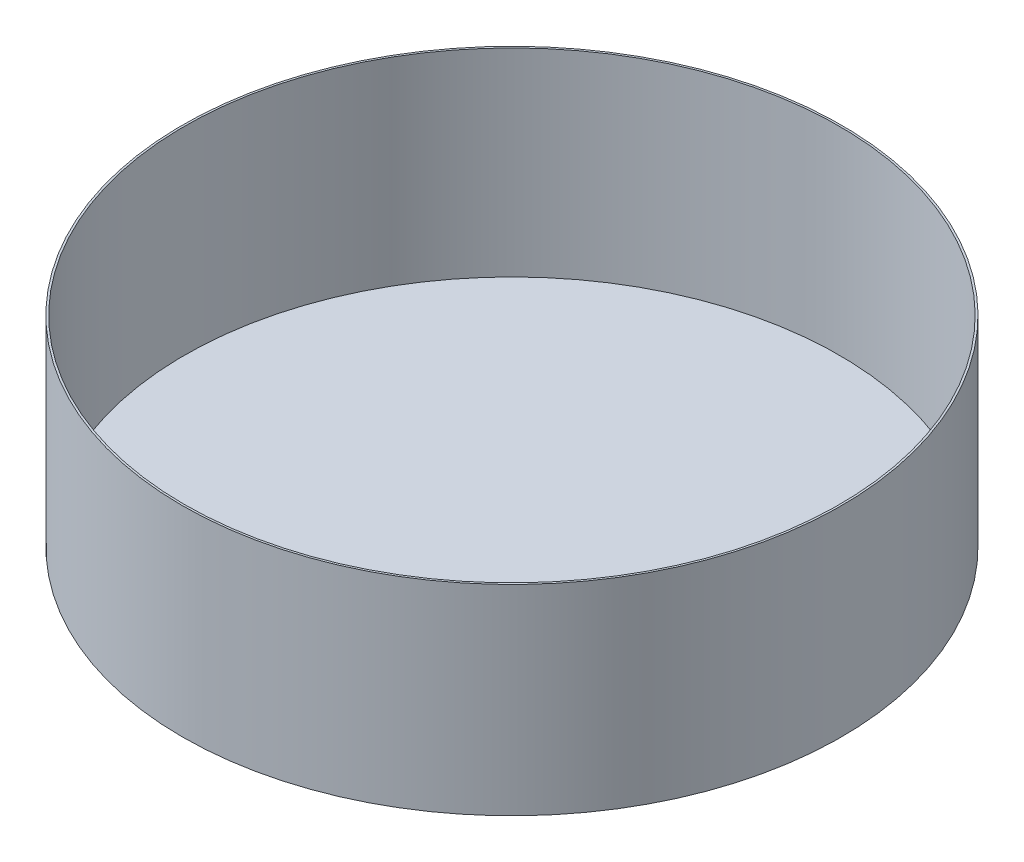
ISO-10303-21;
HEADER;
FILE_DESCRIPTION(('STEP AP214'),'2;1');
FILE_NAME('part.step','',(''),(''),'','','');
FILE_SCHEMA(('AUTOMOTIVE_DESIGN { 1 0 10303 214 1 1 1 1 }'));
ENDSEC;
DATA;
#1=APPLICATION_CONTEXT('core data for automotive mechanical design processes');
#2=APPLICATION_PROTOCOL_DEFINITION('international standard','automotive_design',2000,#1);
#3=PRODUCT_CONTEXT('',#1,'mechanical');
#4=PRODUCT('Part','Part','',(#3));
#5=PRODUCT_RELATED_PRODUCT_CATEGORY('part','',(#4));
#6=PRODUCT_DEFINITION_FORMATION('','',#4);
#7=PRODUCT_DEFINITION_CONTEXT('part definition',#1,'design');
#8=PRODUCT_DEFINITION('design','',#6,#7);
#9=PRODUCT_DEFINITION_SHAPE('','',#8);
#10=(LENGTH_UNIT() NAMED_UNIT(*) SI_UNIT(.MILLI.,.METRE.));
#11=(NAMED_UNIT(*) PLANE_ANGLE_UNIT() SI_UNIT($,.RADIAN.));
#12=(NAMED_UNIT(*) SI_UNIT($,.STERADIAN.) SOLID_ANGLE_UNIT());
#13=UNCERTAINTY_MEASURE_WITH_UNIT(LENGTH_MEASURE(1.E-05),#10,'distance_accuracy_value','');
#14=(GEOMETRIC_REPRESENTATION_CONTEXT(3) GLOBAL_UNCERTAINTY_ASSIGNED_CONTEXT((#13)) GLOBAL_UNIT_ASSIGNED_CONTEXT((#10,
#11,#12)) REPRESENTATION_CONTEXT('',''));
#15=CARTESIAN_POINT('',(0.,0.,0.));
#16=DIRECTION('',(0.,0.,1.));
#17=DIRECTION('',(1.,0.,0.));
#18=AXIS2_PLACEMENT_3D('',#15,#16,#17);
#19=CARTESIAN_POINT('',(0.,25.,0.));
#20=DIRECTION('',(0.,-1.,0.));
#21=DIRECTION('',(0.,0.,-1.));
#22=AXIS2_PLACEMENT_3D('',#19,#20,#21);
#23=CYLINDRICAL_SURFACE('',#22,41.125);
#24=CARTESIAN_POINT('',(0.,25.,0.));
#25=DIRECTION('',(0.,1.,0.));
#26=DIRECTION('',(0.,0.,1.));
#27=AXIS2_PLACEMENT_3D('',#24,#25,#26);
#28=CIRCLE('',#27,41.125);
#29=CARTESIAN_POINT('',(0.,25.,41.125));
#30=VERTEX_POINT('',#29);
#31=EDGE_CURVE('E10',#30,#30,#28,.T.);
#32=ORIENTED_EDGE('',*,*,#31,.F.);
#33=EDGE_LOOP('',(#32));
#34=FACE_BOUND('',#33,.T.);
#35=CARTESIAN_POINT('',(0.,0.,0.));
#36=DIRECTION('',(0.,1.,0.));
#37=DIRECTION('',(0.,0.,1.));
#38=AXIS2_PLACEMENT_3D('',#35,#36,#37);
#39=CIRCLE('',#38,41.125);
#40=CARTESIAN_POINT('',(0.,0.,41.125));
#41=VERTEX_POINT('',#40);
#42=EDGE_CURVE('E34',#41,#41,#39,.T.);
#43=ORIENTED_EDGE('',*,*,#42,.T.);
#44=EDGE_LOOP('',(#43));
#45=FACE_BOUND('',#44,.T.);
#46=ADVANCED_FACE('F31',(#34,#45),#23,.T.);
#47=CARTESIAN_POINT('',(0.,25.,0.));
#48=DIRECTION('',(0.,1.,0.));
#49=DIRECTION('',(0.,0.,1.));
#50=AXIS2_PLACEMENT_3D('',#47,#48,#49);
#51=PLANE('',#50);
#52=CARTESIAN_POINT('',(0.,25.,0.));
#53=DIRECTION('',(0.,1.,0.));
#54=DIRECTION('',(0.,0.,1.));
#55=AXIS2_PLACEMENT_3D('',#52,#53,#54);
#56=CIRCLE('',#55,40.875);
#57=CARTESIAN_POINT('',(0.,25.,40.875));
#58=VERTEX_POINT('',#57);
#59=EDGE_CURVE('E41',#58,#58,#56,.T.);
#60=ORIENTED_EDGE('',*,*,#59,.F.);
#61=EDGE_LOOP('',(#60));
#62=FACE_BOUND('',#61,.T.);
#63=ORIENTED_EDGE('',*,*,#31,.T.);
#64=EDGE_LOOP('',(#63));
#65=FACE_BOUND('',#64,.T.);
#66=ADVANCED_FACE('F61',(#62,#65),#51,.T.);
#67=CARTESIAN_POINT('',(0.,0.,0.));
#68=DIRECTION('',(0.,1.,0.));
#69=DIRECTION('',(0.,0.,1.));
#70=AXIS2_PLACEMENT_3D('',#67,#68,#69);
#71=PLANE('',#70);
#72=ORIENTED_EDGE('',*,*,#42,.F.);
#73=EDGE_LOOP('',(#72));
#74=FACE_BOUND('',#73,.T.);
#75=ADVANCED_FACE('F53',(#74),#71,.F.);
#76=CARTESIAN_POINT('',(0.,25.,0.));
#77=DIRECTION('',(0.,-1.,0.));
#78=DIRECTION('',(0.,0.,-1.));
#79=AXIS2_PLACEMENT_3D('',#76,#77,#78);
#80=CYLINDRICAL_SURFACE('',#79,40.875);
#81=ORIENTED_EDGE('',*,*,#59,.T.);
#82=EDGE_LOOP('',(#81));
#83=FACE_BOUND('',#82,.T.);
#84=CARTESIAN_POINT('',(0.,0.25,0.));
#85=DIRECTION('',(0.,1.,0.));
#86=DIRECTION('',(0.,0.,1.));
#87=AXIS2_PLACEMENT_3D('',#84,#85,#86);
#88=CIRCLE('',#87,40.875);
#89=CARTESIAN_POINT('',(0.,0.25,40.875));
#90=VERTEX_POINT('',#89);
#91=EDGE_CURVE('E45',#90,#90,#88,.T.);
#92=ORIENTED_EDGE('',*,*,#91,.F.);
#93=EDGE_LOOP('',(#92));
#94=FACE_BOUND('',#93,.T.);
#95=ADVANCED_FACE('F51',(#83,#94),#80,.F.);
#96=CARTESIAN_POINT('',(0.,0.25,0.));
#97=DIRECTION('',(0.,1.,0.));
#98=DIRECTION('',(0.,0.,1.));
#99=AXIS2_PLACEMENT_3D('',#96,#97,#98);
#100=PLANE('',#99);
#101=ORIENTED_EDGE('',*,*,#91,.T.);
#102=EDGE_LOOP('',(#101));
#103=FACE_BOUND('',#102,.T.);
#104=ADVANCED_FACE('F49',(#103),#100,.T.);
#105=CLOSED_SHELL('',(#46,#66,#75,#95,#104));
#106=MANIFOLD_SOLID_BREP('B2',#105);
#107=ADVANCED_BREP_SHAPE_REPRESENTATION('',(#18,#106),#14);
#108=SHAPE_DEFINITION_REPRESENTATION(#9,#107);
ENDSEC;
END-ISO-10303-21;
